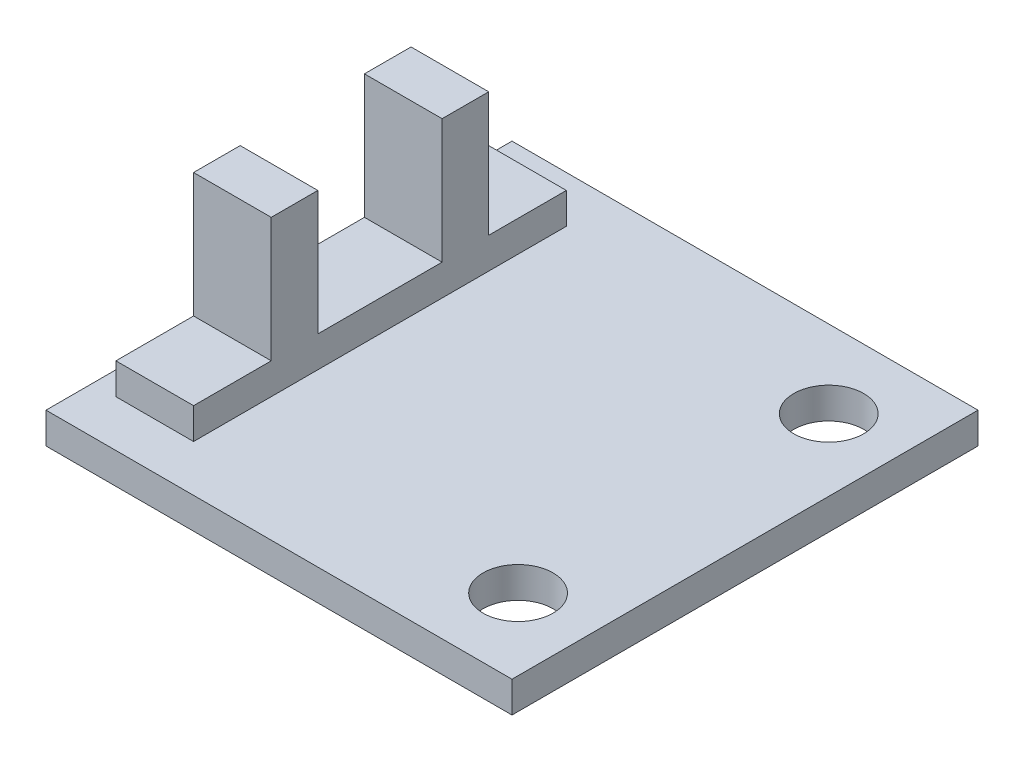
ISO-10303-21;
HEADER;
FILE_DESCRIPTION(('STEP AP214'),'2;1');
FILE_NAME('part.step','',(''),(''),'','','');
FILE_SCHEMA(('AUTOMOTIVE_DESIGN { 1 0 10303 214 1 1 1 1 }'));
ENDSEC;
DATA;
#1=APPLICATION_CONTEXT('core data for automotive mechanical design processes');
#2=APPLICATION_PROTOCOL_DEFINITION('international standard','automotive_design',2000,#1);
#3=PRODUCT_CONTEXT('',#1,'mechanical');
#4=PRODUCT('Part','Part','',(#3));
#5=PRODUCT_RELATED_PRODUCT_CATEGORY('part','',(#4));
#6=PRODUCT_DEFINITION_FORMATION('','',#4);
#7=PRODUCT_DEFINITION_CONTEXT('part definition',#1,'design');
#8=PRODUCT_DEFINITION('design','',#6,#7);
#9=PRODUCT_DEFINITION_SHAPE('','',#8);
#10=(LENGTH_UNIT() NAMED_UNIT(*) SI_UNIT(.MILLI.,.METRE.));
#11=(NAMED_UNIT(*) PLANE_ANGLE_UNIT() SI_UNIT($,.RADIAN.));
#12=(NAMED_UNIT(*) SI_UNIT($,.STERADIAN.) SOLID_ANGLE_UNIT());
#13=UNCERTAINTY_MEASURE_WITH_UNIT(LENGTH_MEASURE(1.E-05),#10,'distance_accuracy_value','');
#14=(GEOMETRIC_REPRESENTATION_CONTEXT(3) GLOBAL_UNCERTAINTY_ASSIGNED_CONTEXT((#13)) GLOBAL_UNIT_ASSIGNED_CONTEXT((#10,
#11,#12)) REPRESENTATION_CONTEXT('',''));
#15=CARTESIAN_POINT('',(0.,0.,0.));
#16=DIRECTION('',(0.,0.,1.));
#17=DIRECTION('',(1.,0.,0.));
#18=AXIS2_PLACEMENT_3D('',#15,#16,#17);
#19=CARTESIAN_POINT('',(1.5,12.,-3.));
#20=DIRECTION('',(0.,0.,-1.));
#21=DIRECTION('',(-1.,0.,0.));
#22=AXIS2_PLACEMENT_3D('',#19,#20,#21);
#23=PLANE('',#22);
#24=DIRECTION('',(1.,0.,0.));
#25=VECTOR('',#24,1.);
#26=CARTESIAN_POINT('',(6.5,4.,-3.));
#27=LINE('',#26,#25);
#28=CARTESIAN_POINT('',(1.5,4.,-3.));
#29=VERTEX_POINT('',#28);
#30=CARTESIAN_POINT('',(6.5,4.,-3.));
#31=VERTEX_POINT('',#30);
#32=EDGE_CURVE('E159',#29,#31,#27,.T.);
#33=ORIENTED_EDGE('',*,*,#32,.F.);
#34=DIRECTION('',(0.,-1.,0.));
#35=VECTOR('',#34,1.);
#36=CARTESIAN_POINT('',(1.5,12.,-3.));
#37=LINE('',#36,#35);
#38=CARTESIAN_POINT('',(1.5,2.,-3.));
#39=VERTEX_POINT('',#38);
#40=EDGE_CURVE('E239',#29,#39,#37,.T.);
#41=ORIENTED_EDGE('',*,*,#40,.T.);
#42=DIRECTION('',(1.,0.,0.));
#43=VECTOR('',#42,1.);
#44=CARTESIAN_POINT('',(1.5,2.,-3.));
#45=LINE('',#44,#43);
#46=CARTESIAN_POINT('',(6.5,2.,-3.));
#47=VERTEX_POINT('',#46);
#48=EDGE_CURVE('E224',#39,#47,#45,.T.);
#49=ORIENTED_EDGE('',*,*,#48,.T.);
#50=DIRECTION('',(0.,-1.,0.));
#51=VECTOR('',#50,1.);
#52=CARTESIAN_POINT('',(6.5,12.,-3.));
#53=LINE('',#52,#51);
#54=EDGE_CURVE('E237',#31,#47,#53,.T.);
#55=ORIENTED_EDGE('',*,*,#54,.F.);
#56=EDGE_LOOP('',(#33,#41,#49,#55));
#57=FACE_BOUND('',#56,.T.);
#58=ADVANCED_FACE('F35',(#57),#23,.F.);
#59=CARTESIAN_POINT('',(0.,12.,0.));
#60=DIRECTION('',(0.,-1.,0.));
#61=DIRECTION('',(0.,0.,-1.));
#62=AXIS2_PLACEMENT_3D('',#59,#60,#61);
#63=PLANE('',#62);
#64=DIRECTION('',(0.,0.,1.));
#65=VECTOR('',#64,1.);
#66=CARTESIAN_POINT('',(1.5,12.,-3.));
#67=LINE('',#66,#65);
#68=CARTESIAN_POINT('',(1.5,12.,-22.));
#69=VERTEX_POINT('',#68);
#70=CARTESIAN_POINT('',(1.5,12.,-19.));
#71=VERTEX_POINT('',#70);
#72=EDGE_CURVE('E216',#69,#71,#67,.T.);
#73=ORIENTED_EDGE('',*,*,#72,.T.);
#74=DIRECTION('',(-1.,0.,0.));
#75=VECTOR('',#74,1.);
#76=CARTESIAN_POINT('',(1.5,12.,-19.));
#77=LINE('',#76,#75);
#78=CARTESIAN_POINT('',(6.5,12.,-19.));
#79=VERTEX_POINT('',#78);
#80=EDGE_CURVE('E179',#79,#71,#77,.T.);
#81=ORIENTED_EDGE('',*,*,#80,.F.);
#82=DIRECTION('',(0.,0.,-1.));
#83=VECTOR('',#82,1.);
#84=CARTESIAN_POINT('',(6.5,12.,-3.));
#85=LINE('',#84,#83);
#86=CARTESIAN_POINT('',(6.5,12.,-22.));
#87=VERTEX_POINT('',#86);
#88=EDGE_CURVE('E219',#79,#87,#85,.T.);
#89=ORIENTED_EDGE('',*,*,#88,.T.);
#90=DIRECTION('',(1.,0.,0.));
#91=VECTOR('',#90,1.);
#92=CARTESIAN_POINT('',(6.5,12.,-22.));
#93=LINE('',#92,#91);
#94=EDGE_CURVE('E170',#69,#87,#93,.T.);
#95=ORIENTED_EDGE('',*,*,#94,.F.);
#96=EDGE_LOOP('',(#73,#81,#89,#95));
#97=FACE_BOUND('',#96,.T.);
#98=ADVANCED_FACE('F294',(#97),#63,.F.);
#99=CARTESIAN_POINT('',(0.,2.,0.));
#100=DIRECTION('',(0.,-1.,0.));
#101=DIRECTION('',(0.,0.,-1.));
#102=AXIS2_PLACEMENT_3D('',#99,#100,#101);
#103=PLANE('',#102);
#104=CARTESIAN_POINT('',(25.3909351279685,2.,-25.));
#105=DIRECTION('',(0.,-1.,0.));
#106=DIRECTION('',(0.,0.,-1.));
#107=AXIS2_PLACEMENT_3D('',#104,#105,#106);
#108=CIRCLE('',#107,2.25);
#109=CARTESIAN_POINT('',(25.3909351279685,2.,-27.25));
#110=VERTEX_POINT('',#109);
#111=EDGE_CURVE('E509',#110,#110,#108,.T.);
#112=ORIENTED_EDGE('',*,*,#111,.T.);
#113=EDGE_LOOP('',(#112));
#114=FACE_BOUND('',#113,.T.);
#115=CARTESIAN_POINT('',(25.3909351279685,2.,-5.));
#116=DIRECTION('',(0.,-1.,0.));
#117=DIRECTION('',(0.,0.,-1.));
#118=AXIS2_PLACEMENT_3D('',#115,#116,#117);
#119=CIRCLE('',#118,2.25);
#120=CARTESIAN_POINT('',(25.3909351279685,2.,-7.25));
#121=VERTEX_POINT('',#120);
#122=EDGE_CURVE('E189',#121,#121,#119,.T.);
#123=ORIENTED_EDGE('',*,*,#122,.T.);
#124=EDGE_LOOP('',(#123));
#125=FACE_BOUND('',#124,.T.);
#126=DIRECTION('',(0.,0.,1.));
#127=VECTOR('',#126,1.);
#128=CARTESIAN_POINT('',(0.,2.,0.));
#129=LINE('',#128,#127);
#130=CARTESIAN_POINT('',(0.,2.,-30.));
#131=VERTEX_POINT('',#130);
#132=CARTESIAN_POINT('',(0.,2.,0.));
#133=VERTEX_POINT('',#132);
#134=EDGE_CURVE('E242',#131,#133,#129,.T.);
#135=ORIENTED_EDGE('',*,*,#134,.T.);
#136=DIRECTION('',(1.,0.,0.));
#137=VECTOR('',#136,1.);
#138=CARTESIAN_POINT('',(0.,2.,0.));
#139=LINE('',#138,#137);
#140=CARTESIAN_POINT('',(30.,2.,0.));
#141=VERTEX_POINT('',#140);
#142=EDGE_CURVE('E245',#133,#141,#139,.T.);
#143=ORIENTED_EDGE('',*,*,#142,.T.);
#144=DIRECTION('',(0.,0.,-1.));
#145=VECTOR('',#144,1.);
#146=CARTESIAN_POINT('',(30.,2.,0.));
#147=LINE('',#146,#145);
#148=CARTESIAN_POINT('',(30.,2.,-30.));
#149=VERTEX_POINT('',#148);
#150=EDGE_CURVE('E248',#141,#149,#147,.T.);
#151=ORIENTED_EDGE('',*,*,#150,.T.);
#152=DIRECTION('',(-1.,0.,0.));
#153=VECTOR('',#152,1.);
#154=CARTESIAN_POINT('',(0.,2.,-30.));
#155=LINE('',#154,#153);
#156=EDGE_CURVE('E250',#149,#131,#155,.T.);
#157=ORIENTED_EDGE('',*,*,#156,.T.);
#158=EDGE_LOOP('',(#135,#143,#151,#157));
#159=FACE_BOUND('',#158,.T.);
#160=DIRECTION('',(0.,0.,1.));
#161=VECTOR('',#160,1.);
#162=CARTESIAN_POINT('',(1.5,2.,-3.));
#163=LINE('',#162,#161);
#164=CARTESIAN_POINT('',(1.5,2.,-27.));
#165=VERTEX_POINT('',#164);
#166=EDGE_CURVE('E214',#165,#39,#163,.T.);
#167=ORIENTED_EDGE('',*,*,#166,.F.);
#168=DIRECTION('',(-1.,0.,0.));
#169=VECTOR('',#168,1.);
#170=CARTESIAN_POINT('',(1.5,2.,-27.));
#171=LINE('',#170,#169);
#172=CARTESIAN_POINT('',(6.5,2.,-27.));
#173=VERTEX_POINT('',#172);
#174=EDGE_CURVE('E230',#173,#165,#171,.T.);
#175=ORIENTED_EDGE('',*,*,#174,.F.);
#176=DIRECTION('',(0.,0.,-1.));
#177=VECTOR('',#176,1.);
#178=CARTESIAN_POINT('',(6.5,2.,-3.));
#179=LINE('',#178,#177);
#180=EDGE_CURVE('E227',#47,#173,#179,.T.);
#181=ORIENTED_EDGE('',*,*,#180,.F.);
#182=ORIENTED_EDGE('',*,*,#48,.F.);
#183=EDGE_LOOP('',(#167,#175,#181,#182));
#184=FACE_BOUND('',#183,.T.);
#185=ADVANCED_FACE('F284',(#114,#125,#159,#184),#103,.F.);
#186=CARTESIAN_POINT('',(0.,2.,0.));
#187=DIRECTION('',(1.,0.,0.));
#188=DIRECTION('',(0.,0.,-1.));
#189=AXIS2_PLACEMENT_3D('',#186,#187,#188);
#190=PLANE('',#189);
#191=DIRECTION('',(0.,0.,1.));
#192=VECTOR('',#191,1.);
#193=CARTESIAN_POINT('',(0.,0.,0.));
#194=LINE('',#193,#192);
#195=CARTESIAN_POINT('',(0.,0.,-30.));
#196=VERTEX_POINT('',#195);
#197=CARTESIAN_POINT('',(0.,0.,0.));
#198=VERTEX_POINT('',#197);
#199=EDGE_CURVE('E241',#196,#198,#194,.T.);
#200=ORIENTED_EDGE('',*,*,#199,.T.);
#201=DIRECTION('',(0.,-1.,0.));
#202=VECTOR('',#201,1.);
#203=CARTESIAN_POINT('',(0.,2.,0.));
#204=LINE('',#203,#202);
#205=EDGE_CURVE('E11',#133,#198,#204,.T.);
#206=ORIENTED_EDGE('',*,*,#205,.F.);
#207=ORIENTED_EDGE('',*,*,#134,.F.);
#208=DIRECTION('',(0.,-1.,0.));
#209=VECTOR('',#208,1.);
#210=CARTESIAN_POINT('',(0.,2.,-30.));
#211=LINE('',#210,#209);
#212=EDGE_CURVE('E252',#131,#196,#211,.T.);
#213=ORIENTED_EDGE('',*,*,#212,.T.);
#214=EDGE_LOOP('',(#200,#206,#207,#213));
#215=FACE_BOUND('',#214,.T.);
#216=ADVANCED_FACE('F37',(#215),#190,.F.);
#217=CARTESIAN_POINT('',(0.,2.,0.));
#218=DIRECTION('',(0.,0.,-1.));
#219=DIRECTION('',(-1.,0.,0.));
#220=AXIS2_PLACEMENT_3D('',#217,#218,#219);
#221=PLANE('',#220);
#222=DIRECTION('',(1.,0.,0.));
#223=VECTOR('',#222,1.);
#224=CARTESIAN_POINT('',(0.,0.,0.));
#225=LINE('',#224,#223);
#226=CARTESIAN_POINT('',(30.,0.,0.));
#227=VERTEX_POINT('',#226);
#228=EDGE_CURVE('E255',#198,#227,#225,.T.);
#229=ORIENTED_EDGE('',*,*,#228,.T.);
#230=DIRECTION('',(0.,-1.,0.));
#231=VECTOR('',#230,1.);
#232=CARTESIAN_POINT('',(30.,2.,0.));
#233=LINE('',#232,#231);
#234=EDGE_CURVE('E43',#141,#227,#233,.T.);
#235=ORIENTED_EDGE('',*,*,#234,.F.);
#236=ORIENTED_EDGE('',*,*,#142,.F.);
#237=ORIENTED_EDGE('',*,*,#205,.T.);
#238=EDGE_LOOP('',(#229,#235,#236,#237));
#239=FACE_BOUND('',#238,.T.);
#240=ADVANCED_FACE('F286',(#239),#221,.F.);
#241=CARTESIAN_POINT('',(30.,2.,0.));
#242=DIRECTION('',(-1.,0.,0.));
#243=DIRECTION('',(0.,0.,1.));
#244=AXIS2_PLACEMENT_3D('',#241,#242,#243);
#245=PLANE('',#244);
#246=DIRECTION('',(0.,0.,-1.));
#247=VECTOR('',#246,1.);
#248=CARTESIAN_POINT('',(30.,0.,0.));
#249=LINE('',#248,#247);
#250=CARTESIAN_POINT('',(30.,0.,-30.));
#251=VERTEX_POINT('',#250);
#252=EDGE_CURVE('E257',#227,#251,#249,.T.);
#253=ORIENTED_EDGE('',*,*,#252,.T.);
#254=DIRECTION('',(0.,-1.,0.));
#255=VECTOR('',#254,1.);
#256=CARTESIAN_POINT('',(30.,2.,-30.));
#257=LINE('',#256,#255);
#258=EDGE_CURVE('E262',#149,#251,#257,.T.);
#259=ORIENTED_EDGE('',*,*,#258,.F.);
#260=ORIENTED_EDGE('',*,*,#150,.F.);
#261=ORIENTED_EDGE('',*,*,#234,.T.);
#262=EDGE_LOOP('',(#253,#259,#260,#261));
#263=FACE_BOUND('',#262,.T.);
#264=ADVANCED_FACE('F269',(#263),#245,.F.);
#265=CARTESIAN_POINT('',(0.,2.,-30.));
#266=DIRECTION('',(0.,0.,1.));
#267=DIRECTION('',(1.,0.,0.));
#268=AXIS2_PLACEMENT_3D('',#265,#266,#267);
#269=PLANE('',#268);
#270=DIRECTION('',(-1.,0.,0.));
#271=VECTOR('',#270,1.);
#272=CARTESIAN_POINT('',(0.,0.,-30.));
#273=LINE('',#272,#271);
#274=EDGE_CURVE('E246',#251,#196,#273,.T.);
#275=ORIENTED_EDGE('',*,*,#274,.T.);
#276=ORIENTED_EDGE('',*,*,#212,.F.);
#277=ORIENTED_EDGE('',*,*,#156,.F.);
#278=ORIENTED_EDGE('',*,*,#258,.T.);
#279=EDGE_LOOP('',(#275,#276,#277,#278));
#280=FACE_BOUND('',#279,.T.);
#281=ADVANCED_FACE('F278',(#280),#269,.F.);
#282=CARTESIAN_POINT('',(0.,0.,0.));
#283=DIRECTION('',(0.,-1.,0.));
#284=DIRECTION('',(0.,0.,-1.));
#285=AXIS2_PLACEMENT_3D('',#282,#283,#284);
#286=PLANE('',#285);
#287=CARTESIAN_POINT('',(25.3909351279685,0.,-25.));
#288=DIRECTION('',(0.,-1.,0.));
#289=DIRECTION('',(0.,0.,-1.));
#290=AXIS2_PLACEMENT_3D('',#287,#288,#289);
#291=CIRCLE('',#290,2.25);
#292=CARTESIAN_POINT('',(25.3909351279685,0.,-27.25));
#293=VERTEX_POINT('',#292);
#294=EDGE_CURVE('E506',#293,#293,#291,.T.);
#295=ORIENTED_EDGE('',*,*,#294,.F.);
#296=EDGE_LOOP('',(#295));
#297=FACE_BOUND('',#296,.T.);
#298=CARTESIAN_POINT('',(25.3909351279685,0.,-5.));
#299=DIRECTION('',(0.,-1.,0.));
#300=DIRECTION('',(0.,0.,-1.));
#301=AXIS2_PLACEMENT_3D('',#298,#299,#300);
#302=CIRCLE('',#301,2.25);
#303=CARTESIAN_POINT('',(25.3909351279685,0.,-7.25));
#304=VERTEX_POINT('',#303);
#305=EDGE_CURVE('E510',#304,#304,#302,.T.);
#306=ORIENTED_EDGE('',*,*,#305,.F.);
#307=EDGE_LOOP('',(#306));
#308=FACE_BOUND('',#307,.T.);
#309=ORIENTED_EDGE('',*,*,#199,.F.);
#310=ORIENTED_EDGE('',*,*,#274,.F.);
#311=ORIENTED_EDGE('',*,*,#252,.F.);
#312=ORIENTED_EDGE('',*,*,#228,.F.);
#313=EDGE_LOOP('',(#309,#310,#311,#312));
#314=FACE_BOUND('',#313,.T.);
#315=ADVANCED_FACE('F275',(#297,#308,#314),#286,.T.);
#316=CARTESIAN_POINT('',(1.5,12.,-3.));
#317=DIRECTION('',(1.,0.,0.));
#318=DIRECTION('',(0.,0.,-1.));
#319=AXIS2_PLACEMENT_3D('',#316,#317,#318);
#320=PLANE('',#319);
#321=DIRECTION('',(0.,0.,1.));
#322=VECTOR('',#321,1.);
#323=CARTESIAN_POINT('',(1.5,4.,-3.));
#324=LINE('',#323,#322);
#325=CARTESIAN_POINT('',(1.5,4.,-8.));
#326=VERTEX_POINT('',#325);
#327=EDGE_CURVE('E153',#326,#29,#324,.T.);
#328=ORIENTED_EDGE('',*,*,#327,.F.);
#329=DIRECTION('',(0.,1.,0.));
#330=VECTOR('',#329,1.);
#331=CARTESIAN_POINT('',(1.5,4.,-8.));
#332=LINE('',#331,#330);
#333=CARTESIAN_POINT('',(1.5,12.,-8.));
#334=VERTEX_POINT('',#333);
#335=EDGE_CURVE('E150',#326,#334,#332,.T.);
#336=ORIENTED_EDGE('',*,*,#335,.T.);
#337=CARTESIAN_POINT('',(1.5,12.,-11.));
#338=VERTEX_POINT('',#337);
#339=EDGE_CURVE('E220',#338,#334,#67,.T.);
#340=ORIENTED_EDGE('',*,*,#339,.F.);
#341=DIRECTION('',(0.,1.,0.));
#342=VECTOR('',#341,1.);
#343=CARTESIAN_POINT('',(1.5,4.,-11.));
#344=LINE('',#343,#342);
#345=CARTESIAN_POINT('',(1.5,4.,-11.));
#346=VERTEX_POINT('',#345);
#347=EDGE_CURVE('E50',#346,#338,#344,.T.);
#348=ORIENTED_EDGE('',*,*,#347,.F.);
#349=DIRECTION('',(0.,0.,1.));
#350=VECTOR('',#349,1.);
#351=CARTESIAN_POINT('',(1.5,4.,-11.));
#352=LINE('',#351,#350);
#353=CARTESIAN_POINT('',(1.5,4.,-19.));
#354=VERTEX_POINT('',#353);
#355=EDGE_CURVE('E175',#354,#346,#352,.T.);
#356=ORIENTED_EDGE('',*,*,#355,.F.);
#357=DIRECTION('',(0.,1.,0.));
#358=VECTOR('',#357,1.);
#359=CARTESIAN_POINT('',(1.5,4.,-19.));
#360=LINE('',#359,#358);
#361=EDGE_CURVE('E191',#354,#71,#360,.T.);
#362=ORIENTED_EDGE('',*,*,#361,.T.);
#363=ORIENTED_EDGE('',*,*,#72,.F.);
#364=DIRECTION('',(0.,1.,0.));
#365=VECTOR('',#364,1.);
#366=CARTESIAN_POINT('',(1.5,4.,-22.));
#367=LINE('',#366,#365);
#368=CARTESIAN_POINT('',(1.5,4.,-22.));
#369=VERTEX_POINT('',#368);
#370=EDGE_CURVE('E208',#369,#69,#367,.T.);
#371=ORIENTED_EDGE('',*,*,#370,.F.);
#372=DIRECTION('',(0.,0.,1.));
#373=VECTOR('',#372,1.);
#374=CARTESIAN_POINT('',(1.5,4.,-27.));
#375=LINE('',#374,#373);
#376=CARTESIAN_POINT('',(1.5,4.,-27.));
#377=VERTEX_POINT('',#376);
#378=EDGE_CURVE('E203',#377,#369,#375,.T.);
#379=ORIENTED_EDGE('',*,*,#378,.F.);
#380=DIRECTION('',(0.,-1.,0.));
#381=VECTOR('',#380,1.);
#382=CARTESIAN_POINT('',(1.5,12.,-27.));
#383=LINE('',#382,#381);
#384=EDGE_CURVE('E233',#377,#165,#383,.T.);
#385=ORIENTED_EDGE('',*,*,#384,.T.);
#386=ORIENTED_EDGE('',*,*,#166,.T.);
#387=ORIENTED_EDGE('',*,*,#40,.F.);
#388=EDGE_LOOP('',(#328,#336,#340,#348,#356,#362,#363,#371,#379,#385,#386,#387));
#389=FACE_BOUND('',#388,.T.);
#390=ADVANCED_FACE('F306',(#389),#320,.F.);
#391=CARTESIAN_POINT('',(6.5,12.,-3.));
#392=DIRECTION('',(-1.,0.,0.));
#393=DIRECTION('',(0.,0.,1.));
#394=AXIS2_PLACEMENT_3D('',#391,#392,#393);
#395=PLANE('',#394);
#396=CARTESIAN_POINT('',(6.5,12.,-8.));
#397=VERTEX_POINT('',#396);
#398=CARTESIAN_POINT('',(6.5,12.,-11.));
#399=VERTEX_POINT('',#398);
#400=EDGE_CURVE('E168',#397,#399,#85,.T.);
#401=ORIENTED_EDGE('',*,*,#400,.F.);
#402=DIRECTION('',(0.,1.,0.));
#403=VECTOR('',#402,1.);
#404=CARTESIAN_POINT('',(6.5,4.,-8.));
#405=LINE('',#404,#403);
#406=CARTESIAN_POINT('',(6.5,4.,-8.));
#407=VERTEX_POINT('',#406);
#408=EDGE_CURVE('E58',#407,#397,#405,.T.);
#409=ORIENTED_EDGE('',*,*,#408,.F.);
#410=DIRECTION('',(0.,0.,-1.));
#411=VECTOR('',#410,1.);
#412=CARTESIAN_POINT('',(6.5,4.,-3.));
#413=LINE('',#412,#411);
#414=EDGE_CURVE('E154',#31,#407,#413,.T.);
#415=ORIENTED_EDGE('',*,*,#414,.F.);
#416=ORIENTED_EDGE('',*,*,#54,.T.);
#417=ORIENTED_EDGE('',*,*,#180,.T.);
#418=DIRECTION('',(0.,-1.,0.));
#419=VECTOR('',#418,1.);
#420=CARTESIAN_POINT('',(6.5,12.,-27.));
#421=LINE('',#420,#419);
#422=CARTESIAN_POINT('',(6.5,4.,-27.));
#423=VERTEX_POINT('',#422);
#424=EDGE_CURVE('E235',#423,#173,#421,.T.);
#425=ORIENTED_EDGE('',*,*,#424,.F.);
#426=DIRECTION('',(0.,0.,-1.));
#427=VECTOR('',#426,1.);
#428=CARTESIAN_POINT('',(6.5,4.,-27.));
#429=LINE('',#428,#427);
#430=CARTESIAN_POINT('',(6.5,4.,-22.));
#431=VERTEX_POINT('',#430);
#432=EDGE_CURVE('E199',#431,#423,#429,.T.);
#433=ORIENTED_EDGE('',*,*,#432,.F.);
#434=DIRECTION('',(0.,1.,0.));
#435=VECTOR('',#434,1.);
#436=CARTESIAN_POINT('',(6.5,4.,-22.));
#437=LINE('',#436,#435);
#438=EDGE_CURVE('E211',#431,#87,#437,.T.);
#439=ORIENTED_EDGE('',*,*,#438,.T.);
#440=ORIENTED_EDGE('',*,*,#88,.F.);
#441=DIRECTION('',(0.,1.,0.));
#442=VECTOR('',#441,1.);
#443=CARTESIAN_POINT('',(6.5,4.,-19.));
#444=LINE('',#443,#442);
#445=CARTESIAN_POINT('',(6.5,4.,-19.));
#446=VERTEX_POINT('',#445);
#447=EDGE_CURVE('E194',#446,#79,#444,.T.);
#448=ORIENTED_EDGE('',*,*,#447,.F.);
#449=DIRECTION('',(0.,0.,-1.));
#450=VECTOR('',#449,1.);
#451=CARTESIAN_POINT('',(6.5,4.,-11.));
#452=LINE('',#451,#450);
#453=CARTESIAN_POINT('',(6.5,4.,-11.));
#454=VERTEX_POINT('',#453);
#455=EDGE_CURVE('E182',#454,#446,#452,.T.);
#456=ORIENTED_EDGE('',*,*,#455,.F.);
#457=DIRECTION('',(0.,1.,0.));
#458=VECTOR('',#457,1.);
#459=CARTESIAN_POINT('',(6.5,4.,-11.));
#460=LINE('',#459,#458);
#461=EDGE_CURVE('E196',#454,#399,#460,.T.);
#462=ORIENTED_EDGE('',*,*,#461,.T.);
#463=EDGE_LOOP('',(#401,#409,#415,#416,#417,#425,#433,#439,#440,#448,#456,#462));
#464=FACE_BOUND('',#463,.T.);
#465=ADVANCED_FACE('F165',(#464),#395,.F.);
#466=CARTESIAN_POINT('',(1.5,12.,-27.));
#467=DIRECTION('',(0.,0.,1.));
#468=DIRECTION('',(1.,0.,0.));
#469=AXIS2_PLACEMENT_3D('',#466,#467,#468);
#470=PLANE('',#469);
#471=ORIENTED_EDGE('',*,*,#384,.F.);
#472=DIRECTION('',(-1.,0.,0.));
#473=VECTOR('',#472,1.);
#474=CARTESIAN_POINT('',(6.5,4.,-27.));
#475=LINE('',#474,#473);
#476=EDGE_CURVE('E201',#423,#377,#475,.T.);
#477=ORIENTED_EDGE('',*,*,#476,.F.);
#478=ORIENTED_EDGE('',*,*,#424,.T.);
#479=ORIENTED_EDGE('',*,*,#174,.T.);
#480=EDGE_LOOP('',(#471,#477,#478,#479));
#481=FACE_BOUND('',#480,.T.);
#482=ADVANCED_FACE('F342',(#481),#470,.F.);
#483=ORIENTED_EDGE('',*,*,#339,.T.);
#484=DIRECTION('',(-1.,0.,0.));
#485=VECTOR('',#484,1.);
#486=CARTESIAN_POINT('',(6.5,12.,-8.));
#487=LINE('',#486,#485);
#488=EDGE_CURVE('E162',#397,#334,#487,.T.);
#489=ORIENTED_EDGE('',*,*,#488,.F.);
#490=ORIENTED_EDGE('',*,*,#400,.T.);
#491=DIRECTION('',(1.,0.,0.));
#492=VECTOR('',#491,1.);
#493=CARTESIAN_POINT('',(1.5,12.,-11.));
#494=LINE('',#493,#492);
#495=EDGE_CURVE('E187',#338,#399,#494,.T.);
#496=ORIENTED_EDGE('',*,*,#495,.F.);
#497=EDGE_LOOP('',(#483,#489,#490,#496));
#498=FACE_BOUND('',#497,.T.);
#499=ADVANCED_FACE('F302',(#498),#63,.F.);
#500=CARTESIAN_POINT('',(6.5,4.,-22.));
#501=DIRECTION('',(0.,0.,1.));
#502=DIRECTION('',(1.,0.,0.));
#503=AXIS2_PLACEMENT_3D('',#500,#501,#502);
#504=PLANE('',#503);
#505=ORIENTED_EDGE('',*,*,#94,.T.);
#506=ORIENTED_EDGE('',*,*,#438,.F.);
#507=DIRECTION('',(1.,0.,0.));
#508=VECTOR('',#507,1.);
#509=CARTESIAN_POINT('',(6.5,4.,-22.));
#510=LINE('',#509,#508);
#511=EDGE_CURVE('E205',#369,#431,#510,.T.);
#512=ORIENTED_EDGE('',*,*,#511,.F.);
#513=ORIENTED_EDGE('',*,*,#370,.T.);
#514=EDGE_LOOP('',(#505,#506,#512,#513));
#515=FACE_BOUND('',#514,.T.);
#516=ADVANCED_FACE('F357',(#515),#504,.F.);
#517=CARTESIAN_POINT('',(0.,4.,0.));
#518=DIRECTION('',(0.,-1.,0.));
#519=DIRECTION('',(0.,0.,-1.));
#520=AXIS2_PLACEMENT_3D('',#517,#518,#519);
#521=PLANE('',#520);
#522=ORIENTED_EDGE('',*,*,#432,.T.);
#523=ORIENTED_EDGE('',*,*,#476,.T.);
#524=ORIENTED_EDGE('',*,*,#378,.T.);
#525=ORIENTED_EDGE('',*,*,#511,.T.);
#526=EDGE_LOOP('',(#522,#523,#524,#525));
#527=FACE_BOUND('',#526,.T.);
#528=ADVANCED_FACE('F365',(#527),#521,.F.);
#529=CARTESIAN_POINT('',(1.5,4.,-19.));
#530=DIRECTION('',(0.,0.,-1.));
#531=DIRECTION('',(-1.,0.,0.));
#532=AXIS2_PLACEMENT_3D('',#529,#530,#531);
#533=PLANE('',#532);
#534=ORIENTED_EDGE('',*,*,#80,.T.);
#535=ORIENTED_EDGE('',*,*,#361,.F.);
#536=DIRECTION('',(-1.,0.,0.));
#537=VECTOR('',#536,1.);
#538=CARTESIAN_POINT('',(1.5,4.,-19.));
#539=LINE('',#538,#537);
#540=EDGE_CURVE('E184',#446,#354,#539,.T.);
#541=ORIENTED_EDGE('',*,*,#540,.F.);
#542=ORIENTED_EDGE('',*,*,#447,.T.);
#543=EDGE_LOOP('',(#534,#535,#541,#542));
#544=FACE_BOUND('',#543,.T.);
#545=ADVANCED_FACE('F372',(#544),#533,.F.);
#546=CARTESIAN_POINT('',(1.5,4.,-11.));
#547=DIRECTION('',(0.,0.,1.));
#548=DIRECTION('',(1.,0.,0.));
#549=AXIS2_PLACEMENT_3D('',#546,#547,#548);
#550=PLANE('',#549);
#551=ORIENTED_EDGE('',*,*,#495,.T.);
#552=ORIENTED_EDGE('',*,*,#461,.F.);
#553=DIRECTION('',(1.,0.,0.));
#554=VECTOR('',#553,1.);
#555=CARTESIAN_POINT('',(1.5,4.,-11.));
#556=LINE('',#555,#554);
#557=EDGE_CURVE('E178',#346,#454,#556,.T.);
#558=ORIENTED_EDGE('',*,*,#557,.F.);
#559=ORIENTED_EDGE('',*,*,#347,.T.);
#560=EDGE_LOOP('',(#551,#552,#558,#559));
#561=FACE_BOUND('',#560,.T.);
#562=ADVANCED_FACE('F379',(#561),#550,.F.);
#563=CARTESIAN_POINT('',(0.,4.,0.));
#564=DIRECTION('',(0.,-1.,0.));
#565=DIRECTION('',(0.,0.,-1.));
#566=AXIS2_PLACEMENT_3D('',#563,#564,#565);
#567=PLANE('',#566);
#568=ORIENTED_EDGE('',*,*,#355,.T.);
#569=ORIENTED_EDGE('',*,*,#557,.T.);
#570=ORIENTED_EDGE('',*,*,#455,.T.);
#571=ORIENTED_EDGE('',*,*,#540,.T.);
#572=EDGE_LOOP('',(#568,#569,#570,#571));
#573=FACE_BOUND('',#572,.T.);
#574=ADVANCED_FACE('F387',(#573),#567,.F.);
#575=CARTESIAN_POINT('',(6.5,4.,-8.));
#576=DIRECTION('',(0.,0.,-1.));
#577=DIRECTION('',(-1.,0.,0.));
#578=AXIS2_PLACEMENT_3D('',#575,#576,#577);
#579=PLANE('',#578);
#580=ORIENTED_EDGE('',*,*,#488,.T.);
#581=ORIENTED_EDGE('',*,*,#335,.F.);
#582=DIRECTION('',(-1.,0.,0.));
#583=VECTOR('',#582,1.);
#584=CARTESIAN_POINT('',(6.5,4.,-8.));
#585=LINE('',#584,#583);
#586=EDGE_CURVE('E146',#407,#326,#585,.T.);
#587=ORIENTED_EDGE('',*,*,#586,.F.);
#588=ORIENTED_EDGE('',*,*,#408,.T.);
#589=EDGE_LOOP('',(#580,#581,#587,#588));
#590=FACE_BOUND('',#589,.T.);
#591=ADVANCED_FACE('F148',(#590),#579,.F.);
#592=CARTESIAN_POINT('',(0.,4.,0.));
#593=DIRECTION('',(0.,1.,0.));
#594=DIRECTION('',(0.,0.,1.));
#595=AXIS2_PLACEMENT_3D('',#592,#593,#594);
#596=PLANE('',#595);
#597=ORIENTED_EDGE('',*,*,#414,.T.);
#598=ORIENTED_EDGE('',*,*,#586,.T.);
#599=ORIENTED_EDGE('',*,*,#327,.T.);
#600=ORIENTED_EDGE('',*,*,#32,.T.);
#601=EDGE_LOOP('',(#597,#598,#599,#600));
#602=FACE_BOUND('',#601,.T.);
#603=ADVANCED_FACE('F157',(#602),#596,.T.);
#604=CARTESIAN_POINT('',(25.3909351279685,10.,-5.));
#605=DIRECTION('',(0.,-1.,0.));
#606=DIRECTION('',(0.,0.,-1.));
#607=AXIS2_PLACEMENT_3D('',#604,#605,#606);
#608=CYLINDRICAL_SURFACE('',#607,2.25);
#609=ORIENTED_EDGE('',*,*,#305,.T.);
#610=EDGE_LOOP('',(#609));
#611=FACE_BOUND('',#610,.T.);
#612=ORIENTED_EDGE('',*,*,#122,.F.);
#613=EDGE_LOOP('',(#612));
#614=FACE_BOUND('',#613,.T.);
#615=ADVANCED_FACE('F405',(#611,#614),#608,.F.);
#616=CARTESIAN_POINT('',(25.3909351279685,10.,-25.));
#617=DIRECTION('',(0.,-1.,0.));
#618=DIRECTION('',(0.,0.,-1.));
#619=AXIS2_PLACEMENT_3D('',#616,#617,#618);
#620=CYLINDRICAL_SURFACE('',#619,2.25);
#621=ORIENTED_EDGE('',*,*,#294,.T.);
#622=EDGE_LOOP('',(#621));
#623=FACE_BOUND('',#622,.T.);
#624=ORIENTED_EDGE('',*,*,#111,.F.);
#625=EDGE_LOOP('',(#624));
#626=FACE_BOUND('',#625,.T.);
#627=ADVANCED_FACE('F411',(#623,#626),#620,.F.);
#628=CLOSED_SHELL('',(#58,#98,#185,#216,#240,#264,#281,#315,#390,#465,#482,#499,#516,#528,#545,
#562,#574,#591,#603,#615,#627));
#629=MANIFOLD_SOLID_BREP('B2',#628);
#630=ADVANCED_BREP_SHAPE_REPRESENTATION('',(#18,#629),#14);
#631=SHAPE_DEFINITION_REPRESENTATION(#9,#630);
ENDSEC;
END-ISO-10303-21;
